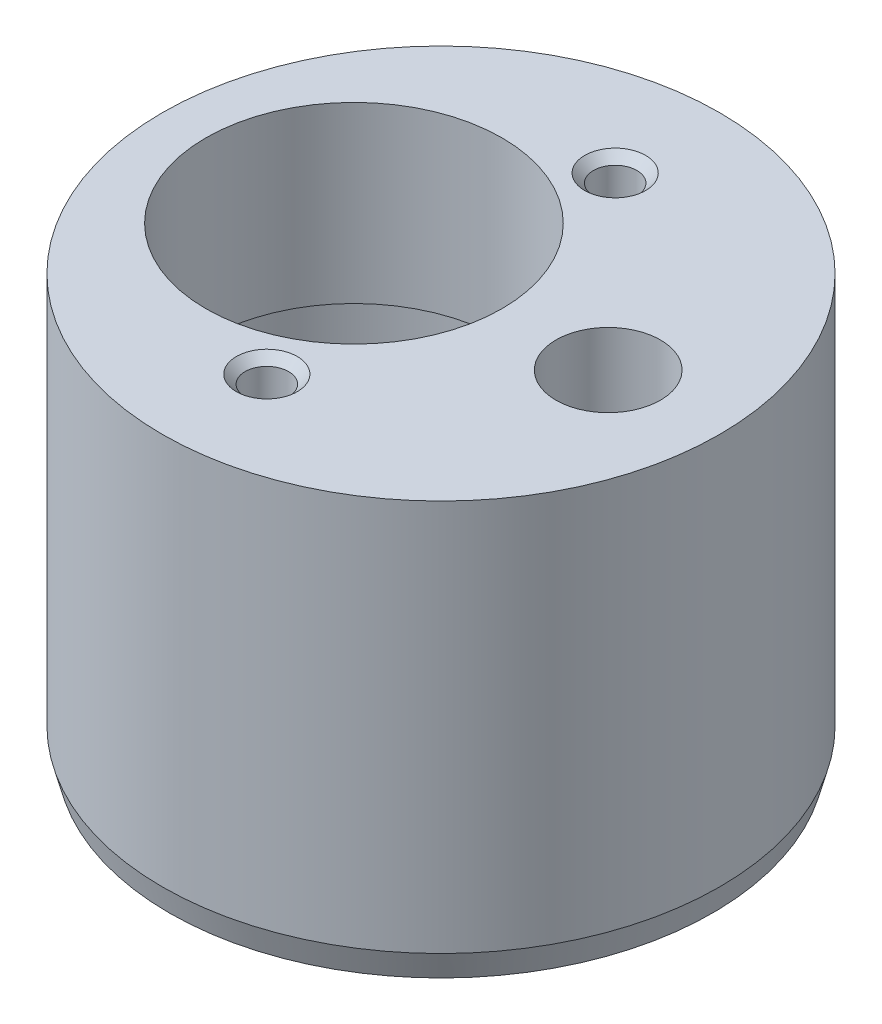
ISO-10303-21;
HEADER;
FILE_DESCRIPTION(('STEP AP214'),'2;1');
FILE_NAME('part.step','',(''),(''),'','','');
FILE_SCHEMA(('AUTOMOTIVE_DESIGN { 1 0 10303 214 1 1 1 1 }'));
ENDSEC;
DATA;
#1=APPLICATION_CONTEXT('core data for automotive mechanical design processes');
#2=APPLICATION_PROTOCOL_DEFINITION('international standard','automotive_design',2000,#1);
#3=PRODUCT_CONTEXT('',#1,'mechanical');
#4=PRODUCT('Part','Part','',(#3));
#5=PRODUCT_RELATED_PRODUCT_CATEGORY('part','',(#4));
#6=PRODUCT_DEFINITION_FORMATION('','',#4);
#7=PRODUCT_DEFINITION_CONTEXT('part definition',#1,'design');
#8=PRODUCT_DEFINITION('design','',#6,#7);
#9=PRODUCT_DEFINITION_SHAPE('','',#8);
#10=(LENGTH_UNIT() NAMED_UNIT(*) SI_UNIT(.MILLI.,.METRE.));
#11=(NAMED_UNIT(*) PLANE_ANGLE_UNIT() SI_UNIT($,.RADIAN.));
#12=(NAMED_UNIT(*) SI_UNIT($,.STERADIAN.) SOLID_ANGLE_UNIT());
#13=UNCERTAINTY_MEASURE_WITH_UNIT(LENGTH_MEASURE(1.E-05),#10,'distance_accuracy_value','');
#14=(GEOMETRIC_REPRESENTATION_CONTEXT(3) GLOBAL_UNCERTAINTY_ASSIGNED_CONTEXT((#13)) GLOBAL_UNIT_ASSIGNED_CONTEXT((#10,
#11,#12)) REPRESENTATION_CONTEXT('',''));
#15=CARTESIAN_POINT('',(0.,0.,0.));
#16=DIRECTION('',(0.,0.,1.));
#17=DIRECTION('',(1.,0.,0.));
#18=AXIS2_PLACEMENT_3D('',#15,#16,#17);
#19=CARTESIAN_POINT('',(0.,24.,0.));
#20=DIRECTION('',(0.,-1.,0.));
#21=DIRECTION('',(0.,0.,-1.));
#22=AXIS2_PLACEMENT_3D('',#19,#20,#21);
#23=CYLINDRICAL_SURFACE('',#22,16.);
#24=CARTESIAN_POINT('',(0.,1.50000000000004,0.));
#25=DIRECTION('',(0.,1.,0.));
#26=DIRECTION('',(0.,0.,1.));
#27=AXIS2_PLACEMENT_3D('',#24,#25,#26);
#28=CIRCLE('',#27,16.);
#29=CARTESIAN_POINT('',(0.,1.50000000000004,16.));
#30=VERTEX_POINT('',#29);
#31=EDGE_CURVE('E96',#30,#30,#28,.T.);
#32=ORIENTED_EDGE('',*,*,#31,.T.);
#33=EDGE_LOOP('',(#32));
#34=FACE_BOUND('',#33,.T.);
#35=CARTESIAN_POINT('',(0.,24.,0.));
#36=DIRECTION('',(0.,1.,0.));
#37=DIRECTION('',(0.,0.,1.));
#38=AXIS2_PLACEMENT_3D('',#35,#36,#37);
#39=CIRCLE('',#38,16.);
#40=CARTESIAN_POINT('',(0.,24.,16.));
#41=VERTEX_POINT('',#40);
#42=EDGE_CURVE('E85',#41,#41,#39,.T.);
#43=ORIENTED_EDGE('',*,*,#42,.F.);
#44=EDGE_LOOP('',(#43));
#45=FACE_BOUND('',#44,.T.);
#46=ADVANCED_FACE('F42',(#34,#45),#23,.T.);
#47=CARTESIAN_POINT('',(0.,24.,0.));
#48=DIRECTION('',(0.,1.,0.));
#49=DIRECTION('',(0.,0.,1.));
#50=AXIS2_PLACEMENT_3D('',#47,#48,#49);
#51=PLANE('',#50);
#52=CARTESIAN_POINT('',(0.,24.,10.));
#53=DIRECTION('',(0.,1.,0.));
#54=DIRECTION('',(0.,0.,1.));
#55=AXIS2_PLACEMENT_3D('',#52,#53,#54);
#56=CIRCLE('',#55,1.74999999999999);
#57=CARTESIAN_POINT('',(0.,24.,11.75));
#58=VERTEX_POINT('',#57);
#59=EDGE_CURVE('E51',#58,#58,#56,.F.);
#60=ORIENTED_EDGE('',*,*,#59,.T.);
#61=EDGE_LOOP('',(#60));
#62=FACE_BOUND('',#61,.T.);
#63=CARTESIAN_POINT('',(0.,24.,-10.));
#64=DIRECTION('',(0.,1.,0.));
#65=DIRECTION('',(0.,0.,1.));
#66=AXIS2_PLACEMENT_3D('',#63,#64,#65);
#67=CIRCLE('',#66,1.74999999999999);
#68=CARTESIAN_POINT('',(0.,24.,-8.25000000000001));
#69=VERTEX_POINT('',#68);
#70=EDGE_CURVE('E105',#69,#69,#67,.F.);
#71=ORIENTED_EDGE('',*,*,#70,.T.);
#72=EDGE_LOOP('',(#71));
#73=FACE_BOUND('',#72,.T.);
#74=CARTESIAN_POINT('',(9.6,24.,0.));
#75=DIRECTION('',(0.,1.,0.));
#76=DIRECTION('',(0.,0.,1.));
#77=AXIS2_PLACEMENT_3D('',#74,#75,#76);
#78=CIRCLE('',#77,3.);
#79=CARTESIAN_POINT('',(9.6,24.,3.));
#80=VERTEX_POINT('',#79);
#81=EDGE_CURVE('E80',#80,#80,#78,.T.);
#82=ORIENTED_EDGE('',*,*,#81,.F.);
#83=EDGE_LOOP('',(#82));
#84=FACE_BOUND('',#83,.T.);
#85=CARTESIAN_POINT('',(-5.,24.,0.));
#86=DIRECTION('',(0.,1.,0.));
#87=DIRECTION('',(0.,0.,1.));
#88=AXIS2_PLACEMENT_3D('',#85,#86,#87);
#89=CIRCLE('',#88,8.5);
#90=CARTESIAN_POINT('',(-5.,24.,8.5));
#91=VERTEX_POINT('',#90);
#92=EDGE_CURVE('E79',#91,#91,#89,.T.);
#93=ORIENTED_EDGE('',*,*,#92,.F.);
#94=EDGE_LOOP('',(#93));
#95=FACE_BOUND('',#94,.T.);
#96=ORIENTED_EDGE('',*,*,#42,.T.);
#97=EDGE_LOOP('',(#96));
#98=FACE_BOUND('',#97,.T.);
#99=ADVANCED_FACE('F110',(#62,#73,#84,#95,#98),#51,.T.);
#100=CARTESIAN_POINT('',(0.,0.,0.));
#101=DIRECTION('',(0.,1.,0.));
#102=DIRECTION('',(0.,0.,1.));
#103=AXIS2_PLACEMENT_3D('',#100,#101,#102);
#104=PLANE('',#103);
#105=CARTESIAN_POINT('',(0.,0.,0.));
#106=DIRECTION('',(0.,1.,0.));
#107=DIRECTION('',(0.,0.,1.));
#108=AXIS2_PLACEMENT_3D('',#105,#106,#107);
#109=CIRCLE('',#108,15.5980762113533);
#110=CARTESIAN_POINT('',(0.,0.,15.5980762113533));
#111=VERTEX_POINT('',#110);
#112=EDGE_CURVE('E99',#111,#111,#109,.F.);
#113=ORIENTED_EDGE('',*,*,#112,.T.);
#114=EDGE_LOOP('',(#113));
#115=FACE_BOUND('',#114,.T.);
#116=CARTESIAN_POINT('',(-5.,0.,0.));
#117=DIRECTION('',(0.,1.,0.));
#118=DIRECTION('',(0.,0.,1.));
#119=AXIS2_PLACEMENT_3D('',#116,#117,#118);
#120=CIRCLE('',#119,10.);
#121=CARTESIAN_POINT('',(-5.,0.,10.));
#122=VERTEX_POINT('',#121);
#123=EDGE_CURVE('E88',#122,#122,#120,.T.);
#124=ORIENTED_EDGE('',*,*,#123,.T.);
#125=EDGE_LOOP('',(#124));
#126=FACE_BOUND('',#125,.T.);
#127=ADVANCED_FACE('F140',(#115,#126),#104,.F.);
#128=CARTESIAN_POINT('',(-5.,10.,0.));
#129=DIRECTION('',(0.,1.,0.));
#130=DIRECTION('',(0.,0.,1.));
#131=AXIS2_PLACEMENT_3D('',#128,#129,#130);
#132=CYLINDRICAL_SURFACE('',#131,8.5);
#133=CARTESIAN_POINT('',(-5.,14.,0.));
#134=DIRECTION('',(0.,1.,0.));
#135=DIRECTION('',(0.,0.,1.));
#136=AXIS2_PLACEMENT_3D('',#133,#134,#135);
#137=CIRCLE('',#136,8.5);
#138=CARTESIAN_POINT('',(-5.,14.,8.5));
#139=VERTEX_POINT('',#138);
#140=EDGE_CURVE('E75',#139,#139,#137,.F.);
#141=ORIENTED_EDGE('',*,*,#140,.T.);
#142=EDGE_LOOP('',(#141));
#143=FACE_BOUND('',#142,.T.);
#144=ORIENTED_EDGE('',*,*,#92,.T.);
#145=EDGE_LOOP('',(#144));
#146=FACE_BOUND('',#145,.T.);
#147=ADVANCED_FACE('F170',(#143,#146),#132,.F.);
#148=CARTESIAN_POINT('',(9.6,4.,0.));
#149=DIRECTION('',(0.,1.,0.));
#150=DIRECTION('',(0.,0.,1.));
#151=AXIS2_PLACEMENT_3D('',#148,#149,#150);
#152=CYLINDRICAL_SURFACE('',#151,3.);
#153=CARTESIAN_POINT('',(9.6,4.,0.));
#154=DIRECTION('',(0.,1.,0.));
#155=DIRECTION('',(0.,0.,1.));
#156=AXIS2_PLACEMENT_3D('',#153,#154,#155);
#157=CIRCLE('',#156,3.);
#158=CARTESIAN_POINT('',(9.6,4.,3.));
#159=VERTEX_POINT('',#158);
#160=EDGE_CURVE('E76',#159,#159,#157,.T.);
#161=ORIENTED_EDGE('',*,*,#160,.F.);
#162=EDGE_LOOP('',(#161));
#163=FACE_BOUND('',#162,.T.);
#164=ORIENTED_EDGE('',*,*,#81,.T.);
#165=EDGE_LOOP('',(#164));
#166=FACE_BOUND('',#165,.T.);
#167=ADVANCED_FACE('F175',(#163,#166),#152,.F.);
#168=CARTESIAN_POINT('',(9.6,4.,0.));
#169=DIRECTION('',(0.,1.,0.));
#170=DIRECTION('',(0.,0.,1.));
#171=AXIS2_PLACEMENT_3D('',#168,#169,#170);
#172=PLANE('',#171);
#173=ORIENTED_EDGE('',*,*,#160,.T.);
#174=EDGE_LOOP('',(#173));
#175=FACE_BOUND('',#174,.T.);
#176=ADVANCED_FACE('F184',(#175),#172,.T.);
#177=CARTESIAN_POINT('',(-5.,14.,0.));
#178=DIRECTION('',(0.,1.,0.));
#179=DIRECTION('',(0.,0.,1.));
#180=AXIS2_PLACEMENT_3D('',#177,#178,#179);
#181=PLANE('',#180);
#182=CARTESIAN_POINT('',(-5.,14.,0.));
#183=DIRECTION('',(0.,1.,0.));
#184=DIRECTION('',(0.,0.,1.));
#185=AXIS2_PLACEMENT_3D('',#182,#183,#184);
#186=CIRCLE('',#185,9.5);
#187=CARTESIAN_POINT('',(-5.,14.,9.5));
#188=VERTEX_POINT('',#187);
#189=EDGE_CURVE('E70',#188,#188,#186,.T.);
#190=ORIENTED_EDGE('',*,*,#189,.F.);
#191=EDGE_LOOP('',(#190));
#192=FACE_BOUND('',#191,.T.);
#193=ORIENTED_EDGE('',*,*,#140,.F.);
#194=EDGE_LOOP('',(#193));
#195=FACE_BOUND('',#194,.T.);
#196=ADVANCED_FACE('F162',(#192,#195),#181,.F.);
#197=CARTESIAN_POINT('',(-5.,14.,0.));
#198=DIRECTION('',(0.,-1.,0.));
#199=DIRECTION('',(0.,0.,-1.));
#200=AXIS2_PLACEMENT_3D('',#197,#198,#199);
#201=CYLINDRICAL_SURFACE('',#200,9.5);
#202=CARTESIAN_POINT('',(-5.,0.866025403784443,0.));
#203=DIRECTION('',(0.,1.,0.));
#204=DIRECTION('',(0.,0.,1.));
#205=AXIS2_PLACEMENT_3D('',#202,#203,#204);
#206=CIRCLE('',#205,9.5);
#207=CARTESIAN_POINT('',(-5.,0.866025403784443,9.5));
#208=VERTEX_POINT('',#207);
#209=EDGE_CURVE('E93',#208,#208,#206,.F.);
#210=ORIENTED_EDGE('',*,*,#209,.T.);
#211=EDGE_LOOP('',(#210));
#212=FACE_BOUND('',#211,.T.);
#213=ORIENTED_EDGE('',*,*,#189,.T.);
#214=EDGE_LOOP('',(#213));
#215=FACE_BOUND('',#214,.T.);
#216=ADVANCED_FACE('F150',(#212,#215),#201,.F.);
#217=CARTESIAN_POINT('',(-5.,0.,0.));
#218=DIRECTION('',(0.,-1.,0.));
#219=DIRECTION('',(0.,0.,-1.));
#220=AXIS2_PLACEMENT_3D('',#217,#218,#219);
#221=CONICAL_SURFACE('',#220,10.,0.523598775598299);
#222=ORIENTED_EDGE('',*,*,#209,.F.);
#223=EDGE_LOOP('',(#222));
#224=FACE_BOUND('',#223,.T.);
#225=ORIENTED_EDGE('',*,*,#123,.F.);
#226=EDGE_LOOP('',(#225));
#227=FACE_BOUND('',#226,.T.);
#228=ADVANCED_FACE('F130',(#224,#227),#221,.F.);
#229=CARTESIAN_POINT('',(0.,1.50000000000004,0.));
#230=DIRECTION('',(0.,1.,0.));
#231=DIRECTION('',(0.,0.,1.));
#232=AXIS2_PLACEMENT_3D('',#229,#230,#231);
#233=CONICAL_SURFACE('',#232,16.,0.261799387799146);
#234=CARTESIAN_POINT('',(0.,0.,15.5980762113533));
#235=CARTESIAN_POINT('',(0.,0.0156250000000001,15.602262917485));
#236=CARTESIAN_POINT('',(0.,0.0312500000000005,15.6064496236168));
#237=CARTESIAN_POINT('',(0.,0.0625000000000013,15.6148230358803));
#238=CARTESIAN_POINT('',(0.,0.0781250000000017,15.619009742012));
#239=CARTESIAN_POINT('',(0.,0.109375000000002,15.6273831542755));
#240=CARTESIAN_POINT('',(0.,0.125000000000003,15.6315698604072));
#241=CARTESIAN_POINT('',(0.,0.156250000000004,15.6399432726707));
#242=CARTESIAN_POINT('',(0.,0.171875000000004,15.6441299788024));
#243=CARTESIAN_POINT('',(0.,0.203125000000005,15.6525033910659));
#244=CARTESIAN_POINT('',(0.,0.218750000000005,15.6566900971976));
#245=CARTESIAN_POINT('',(0.,0.250000000000006,15.6650635094611));
#246=CARTESIAN_POINT('',(0.,0.265625000000006,15.6692502155928));
#247=CARTESIAN_POINT('',(0.,0.296875000000007,15.6776236278563));
#248=CARTESIAN_POINT('',(0.,0.312500000000007,15.681810333988));
#249=CARTESIAN_POINT('',(0.,0.343750000000008,15.6901837462515));
#250=CARTESIAN_POINT('',(0.,0.359375000000008,15.6943704523832));
#251=CARTESIAN_POINT('',(0.,0.390625000000009,15.7027438646467));
#252=CARTESIAN_POINT('',(0.,0.40625000000001,15.7069305707785));
#253=CARTESIAN_POINT('',(0.,0.43750000000001,15.7153039830419));
#254=CARTESIAN_POINT('',(0.,0.453125000000011,15.7194906891737));
#255=CARTESIAN_POINT('',(0.,0.484375000000011,15.7278641014371));
#256=CARTESIAN_POINT('',(0.,0.500000000000012,15.7320508075689));
#257=CARTESIAN_POINT('',(0.,0.531250000000013,15.7404242198323));
#258=CARTESIAN_POINT('',(0.,0.546875000000013,15.7446109259641));
#259=CARTESIAN_POINT('',(0.,0.578125000000014,15.7529843382276));
#260=CARTESIAN_POINT('',(0.,0.593750000000014,15.7571710443593));
#261=CARTESIAN_POINT('',(0.,0.625000000000015,15.7655444566228));
#262=CARTESIAN_POINT('',(0.,0.640625000000015,15.7697311627545));
#263=CARTESIAN_POINT('',(0.,0.671875000000016,15.778104575018));
#264=CARTESIAN_POINT('',(0.,0.687500000000016,15.7822912811497));
#265=CARTESIAN_POINT('',(0.,0.718750000000017,15.7906646934132));
#266=CARTESIAN_POINT('',(0.,0.734375000000018,15.7948513995449));
#267=CARTESIAN_POINT('',(0.,0.765625000000018,15.8032248118084));
#268=CARTESIAN_POINT('',(0.,0.781250000000019,15.8074115179401));
#269=CARTESIAN_POINT('',(0.,0.812500000000019,15.8157849302036));
#270=CARTESIAN_POINT('',(0.,0.82812500000002,15.8199716363353));
#271=CARTESIAN_POINT('',(0.,0.859375000000021,15.8283450485988));
#272=CARTESIAN_POINT('',(0.,0.875000000000021,15.8325317547305));
#273=CARTESIAN_POINT('',(0.,0.906250000000022,15.840905166994));
#274=CARTESIAN_POINT('',(0.,0.921875000000022,15.8450918731258));
#275=CARTESIAN_POINT('',(0.,0.953125000000023,15.8534652853892));
#276=CARTESIAN_POINT('',(0.,0.968750000000023,15.857651991521));
#277=CARTESIAN_POINT('',(0.,1.00000000000002,15.8660254037844));
#278=CARTESIAN_POINT('',(0.,1.01562500000002,15.8702121099162));
#279=CARTESIAN_POINT('',(0.,1.04687500000003,15.8785855221796));
#280=CARTESIAN_POINT('',(0.,1.06250000000003,15.8827722283114));
#281=CARTESIAN_POINT('',(0.,1.09375000000003,15.8911456405749));
#282=CARTESIAN_POINT('',(0.,1.10937500000003,15.8953323467066));
#283=CARTESIAN_POINT('',(0.,1.14062500000003,15.9037057589701));
#284=CARTESIAN_POINT('',(0.,1.15625000000003,15.9078924651018));
#285=CARTESIAN_POINT('',(0.,1.18750000000003,15.9162658773653));
#286=CARTESIAN_POINT('',(0.,1.20312500000003,15.920452583497));
#287=CARTESIAN_POINT('',(0.,1.23437500000003,15.9288259957605));
#288=CARTESIAN_POINT('',(0.,1.25000000000003,15.9330127018922));
#289=CARTESIAN_POINT('',(0.,1.28125000000003,15.9413861141557));
#290=CARTESIAN_POINT('',(0.,1.29687500000003,15.9455728202874));
#291=CARTESIAN_POINT('',(0.,1.32812500000003,15.9539462325509));
#292=CARTESIAN_POINT('',(0.,1.34375000000003,15.9581329386826));
#293=CARTESIAN_POINT('',(0.,1.37500000000003,15.9665063509461));
#294=CARTESIAN_POINT('',(0.,1.39062500000003,15.9706930570778));
#295=CARTESIAN_POINT('',(0.,1.42187500000003,15.9790664693413));
#296=CARTESIAN_POINT('',(0.,1.43750000000003,15.9832531754731));
#297=CARTESIAN_POINT('',(0.,1.46875000000004,15.9916265877365));
#298=CARTESIAN_POINT('',(0.,1.48437500000004,15.9958132938683));
#299=CARTESIAN_POINT('',(0.,1.50000000000004,16.));
#300=B_SPLINE_CURVE_WITH_KNOTS('',3,(#234,#235,#236,#237,#238,#239,#240,#241,#242,#243,#244,
#245,#246,#247,#248,#249,#250,#251,#252,#253,#254,#255,#256,#257,#258,#259,#260,#261,#262,#263,
#264,#265,#266,#267,#268,#269,#270,#271,#272,#273,#274,#275,#276,#277,#278,#279,#280,#281,#282,
#283,#284,#285,#286,#287,#288,#289,#290,#291,#292,#293,#294,#295,#296,#297,#298,#299),
.UNSPECIFIED.,.F.,.F.,(4,2,2,2,2,2,2,2,2,2,2,2,2,2,2,2,2,2,2,2,2,2,2,2,2,2,2,2,2,2,2,2,4),(0.,
0.0485285709567237,0.0970571419134473,0.145585712870171,0.194114283826895,0.242642854783619,
0.291171425740343,0.339699996697067,0.38822856765379,0.436757138610514,0.485285709567237,
0.533814280523961,0.582342851480685,0.630871422437409,0.679399993394133,0.727928564350857,
0.776457135307581,0.824985706264304,0.873514277221028,0.922042848177752,0.970571419134475,
1.0190999900912,1.06762856104792,1.11615713200465,1.16468570296137,1.21321427391809,
1.26174284487482,1.31027141583154,1.35879998678827,1.40732855774499,1.45585712870171,
1.50438569965844,1.55291427061516),.UNSPECIFIED.);
#301=EDGE_CURVE('BSEAM125',#111,#30,#300,.T.);
#302=ORIENTED_EDGE('',*,*,#112,.F.);
#303=ORIENTED_EDGE('',*,*,#31,.F.);
#304=ORIENTED_EDGE('',*,*,#301,.T.);
#305=ORIENTED_EDGE('',*,*,#301,.F.);
#306=EDGE_LOOP('',(#302,#304,#303,#305));
#307=FACE_BOUND('',#306,.T.);
#308=ADVANCED_FACE('F125',(#307),#233,.T.);
#309=CARTESIAN_POINT('',(0.,18.5,10.));
#310=DIRECTION('',(0.,1.,0.));
#311=DIRECTION('',(0.,0.,1.));
#312=AXIS2_PLACEMENT_3D('',#309,#310,#311);
#313=CONICAL_SURFACE('',#312,1.25,1.02974425867665);
#314=CARTESIAN_POINT('',(0.,17.7489242262155,10.));
#315=VERTEX_POINT('',#314);
#316=VERTEX_LOOP('',#315);
#317=FACE_BOUND('',#316,.T.);
#318=CARTESIAN_POINT('',(0.,18.5,10.));
#319=DIRECTION('',(0.,1.,0.));
#320=DIRECTION('',(0.,0.,1.));
#321=AXIS2_PLACEMENT_3D('',#318,#319,#320);
#322=CIRCLE('',#321,1.25);
#323=CARTESIAN_POINT('',(0.,18.5,11.25));
#324=VERTEX_POINT('',#323);
#325=EDGE_CURVE('E67',#324,#324,#322,.T.);
#326=ORIENTED_EDGE('',*,*,#325,.T.);
#327=EDGE_LOOP('',(#326));
#328=FACE_BOUND('',#327,.T.);
#329=ADVANCED_FACE('F120',(#317,#328),#313,.F.);
#330=CARTESIAN_POINT('',(0.,24.,10.));
#331=DIRECTION('',(0.,1.,0.));
#332=DIRECTION('',(0.,0.,1.));
#333=AXIS2_PLACEMENT_3D('',#330,#331,#332);
#334=CYLINDRICAL_SURFACE('',#333,1.24999999999999);
#335=CARTESIAN_POINT('',(0.,23.5,10.));
#336=DIRECTION('',(0.,1.,0.));
#337=DIRECTION('',(0.,0.,1.));
#338=AXIS2_PLACEMENT_3D('',#335,#336,#337);
#339=CIRCLE('',#338,1.24999999999999);
#340=CARTESIAN_POINT('',(0.,23.5,11.25));
#341=VERTEX_POINT('',#340);
#342=EDGE_CURVE('E102',#341,#341,#339,.T.);
#343=ORIENTED_EDGE('',*,*,#342,.T.);
#344=EDGE_LOOP('',(#343));
#345=FACE_BOUND('',#344,.T.);
#346=ORIENTED_EDGE('',*,*,#325,.F.);
#347=EDGE_LOOP('',(#346));
#348=FACE_BOUND('',#347,.T.);
#349=ADVANCED_FACE('F61',(#345,#348),#334,.F.);
#350=CARTESIAN_POINT('',(0.,18.5,-10.));
#351=DIRECTION('',(0.,1.,0.));
#352=DIRECTION('',(0.,0.,1.));
#353=AXIS2_PLACEMENT_3D('',#350,#351,#352);
#354=CONICAL_SURFACE('',#353,1.25,1.02974425867665);
#355=CARTESIAN_POINT('',(0.,17.7489242262155,-10.));
#356=VERTEX_POINT('',#355);
#357=VERTEX_LOOP('',#356);
#358=FACE_BOUND('',#357,.T.);
#359=CARTESIAN_POINT('',(0.,18.5,-10.));
#360=DIRECTION('',(0.,1.,0.));
#361=DIRECTION('',(0.,0.,1.));
#362=AXIS2_PLACEMENT_3D('',#359,#360,#361);
#363=CIRCLE('',#362,1.25);
#364=CARTESIAN_POINT('',(0.,18.5,-8.75));
#365=VERTEX_POINT('',#364);
#366=EDGE_CURVE('E65',#365,#365,#363,.T.);
#367=ORIENTED_EDGE('',*,*,#366,.T.);
#368=EDGE_LOOP('',(#367));
#369=FACE_BOUND('',#368,.T.);
#370=ADVANCED_FACE('F57',(#358,#369),#354,.F.);
#371=CARTESIAN_POINT('',(0.,24.,-10.));
#372=DIRECTION('',(0.,1.,0.));
#373=DIRECTION('',(0.,0.,1.));
#374=AXIS2_PLACEMENT_3D('',#371,#372,#373);
#375=CYLINDRICAL_SURFACE('',#374,1.24999999999999);
#376=CARTESIAN_POINT('',(0.,23.5,-10.));
#377=DIRECTION('',(0.,1.,0.));
#378=DIRECTION('',(0.,0.,1.));
#379=AXIS2_PLACEMENT_3D('',#376,#377,#378);
#380=CIRCLE('',#379,1.24999999999999);
#381=CARTESIAN_POINT('',(0.,23.5,-8.75000000000001));
#382=VERTEX_POINT('',#381);
#383=EDGE_CURVE('E11',#382,#382,#380,.T.);
#384=ORIENTED_EDGE('',*,*,#383,.T.);
#385=EDGE_LOOP('',(#384));
#386=FACE_BOUND('',#385,.T.);
#387=ORIENTED_EDGE('',*,*,#366,.F.);
#388=EDGE_LOOP('',(#387));
#389=FACE_BOUND('',#388,.T.);
#390=ADVANCED_FACE('F60',(#386,#389),#375,.F.);
#391=CARTESIAN_POINT('',(0.,23.5,10.));
#392=DIRECTION('',(0.,1.,0.));
#393=DIRECTION('',(0.,0.,1.));
#394=AXIS2_PLACEMENT_3D('',#391,#392,#393);
#395=CONICAL_SURFACE('',#394,1.24999999999999,0.785398163397449);
#396=ORIENTED_EDGE('',*,*,#59,.F.);
#397=EDGE_LOOP('',(#396));
#398=FACE_BOUND('',#397,.T.);
#399=ORIENTED_EDGE('',*,*,#342,.F.);
#400=EDGE_LOOP('',(#399));
#401=FACE_BOUND('',#400,.T.);
#402=ADVANCED_FACE('F113',(#398,#401),#395,.F.);
#403=CARTESIAN_POINT('',(0.,23.5,-10.));
#404=DIRECTION('',(0.,1.,0.));
#405=DIRECTION('',(0.,0.,1.));
#406=AXIS2_PLACEMENT_3D('',#403,#404,#405);
#407=CONICAL_SURFACE('',#406,1.24999999999999,0.785398163397449);
#408=ORIENTED_EDGE('',*,*,#70,.F.);
#409=EDGE_LOOP('',(#408));
#410=FACE_BOUND('',#409,.T.);
#411=ORIENTED_EDGE('',*,*,#383,.F.);
#412=EDGE_LOOP('',(#411));
#413=FACE_BOUND('',#412,.T.);
#414=ADVANCED_FACE('F45',(#410,#413),#407,.F.);
#415=CLOSED_SHELL('',(#46,#99,#127,#147,#167,#176,#196,#216,#228,#308,#329,#349,#370,#390,#402,#414));
#416=MANIFOLD_SOLID_BREP('B2',#415);
#417=ADVANCED_BREP_SHAPE_REPRESENTATION('',(#18,#416),#14);
#418=SHAPE_DEFINITION_REPRESENTATION(#9,#417);
ENDSEC;
END-ISO-10303-21;
